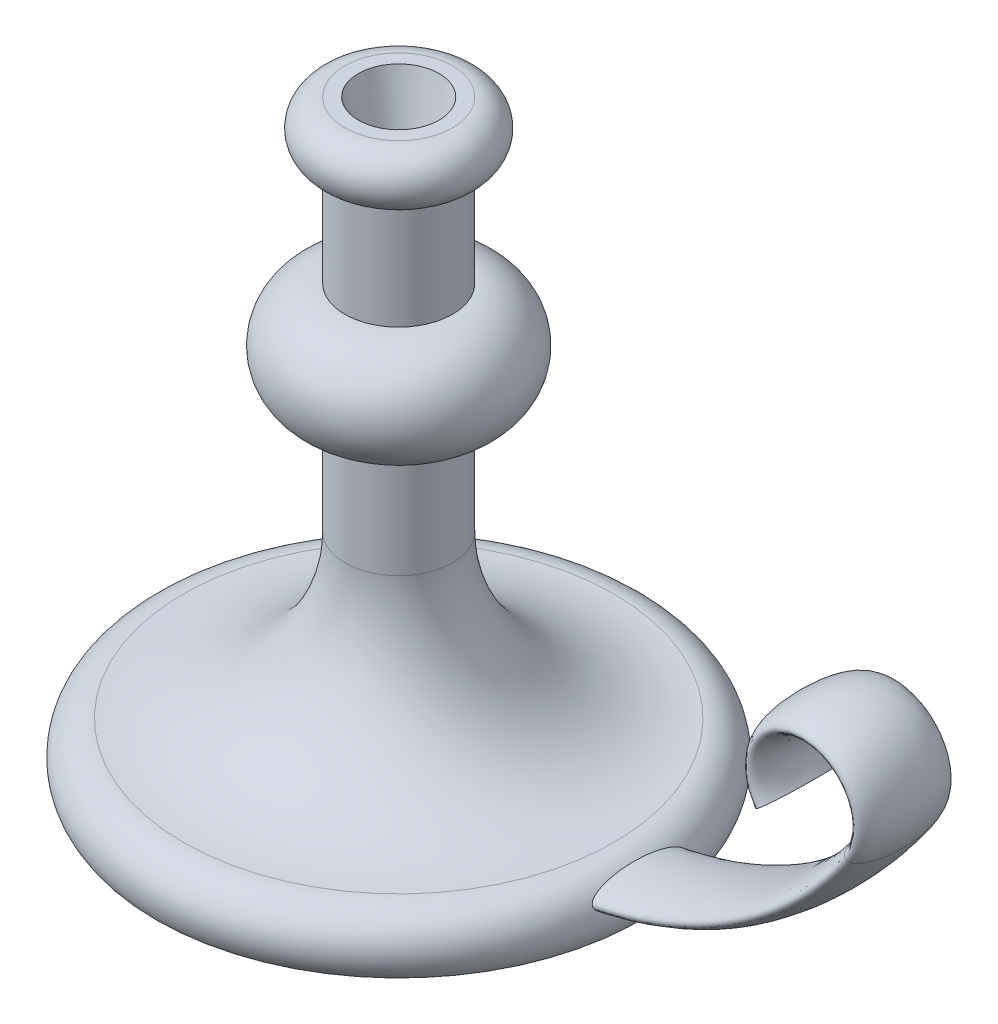
ISO-10303-21;
HEADER;
FILE_DESCRIPTION(('STEP AP214'),'2;1');
FILE_NAME('part.step','',(''),(''),'','','');
FILE_SCHEMA(('AUTOMOTIVE_DESIGN { 1 0 10303 214 1 1 1 1 }'));
ENDSEC;
DATA;
#1=APPLICATION_CONTEXT('core data for automotive mechanical design processes');
#2=APPLICATION_PROTOCOL_DEFINITION('international standard','automotive_design',2000,#1);
#3=PRODUCT_CONTEXT('',#1,'mechanical');
#4=PRODUCT('Part','Part','',(#3));
#5=PRODUCT_RELATED_PRODUCT_CATEGORY('part','',(#4));
#6=PRODUCT_DEFINITION_FORMATION('','',#4);
#7=PRODUCT_DEFINITION_CONTEXT('part definition',#1,'design');
#8=PRODUCT_DEFINITION('design','',#6,#7);
#9=PRODUCT_DEFINITION_SHAPE('','',#8);
#10=(LENGTH_UNIT() NAMED_UNIT(*) SI_UNIT(.MILLI.,.METRE.));
#11=(NAMED_UNIT(*) PLANE_ANGLE_UNIT() SI_UNIT($,.RADIAN.));
#12=(NAMED_UNIT(*) SI_UNIT($,.STERADIAN.) SOLID_ANGLE_UNIT());
#13=UNCERTAINTY_MEASURE_WITH_UNIT(LENGTH_MEASURE(1.E-05),#10,'distance_accuracy_value','');
#14=(GEOMETRIC_REPRESENTATION_CONTEXT(3) GLOBAL_UNCERTAINTY_ASSIGNED_CONTEXT((#13)) GLOBAL_UNIT_ASSIGNED_CONTEXT((#10,
#11,#12)) REPRESENTATION_CONTEXT('',''));
#15=CARTESIAN_POINT('',(0.,0.,0.));
#16=DIRECTION('',(0.,0.,1.));
#17=DIRECTION('',(1.,0.,0.));
#18=AXIS2_PLACEMENT_3D('',#15,#16,#17);
#19=CARTESIAN_POINT('',(0.,0.,0.));
#20=DIRECTION('',(0.,-1.,0.));
#21=DIRECTION('',(0.,0.,-1.));
#22=AXIS2_PLACEMENT_3D('',#19,#20,#21);
#23=PLANE('',#22);
#24=CARTESIAN_POINT('',(0.,0.,0.));
#25=DIRECTION('',(0.,-1.,0.));
#26=DIRECTION('',(0.,0.,-1.));
#27=AXIS2_PLACEMENT_3D('',#24,#25,#26);
#28=CIRCLE('',#27,90.);
#29=CARTESIAN_POINT('',(0.,0.,-90.));
#30=VERTEX_POINT('',#29);
#31=EDGE_CURVE('E81',#30,#30,#28,.T.);
#32=ORIENTED_EDGE('',*,*,#31,.T.);
#33=EDGE_LOOP('',(#32));
#34=FACE_BOUND('',#33,.T.);
#35=ADVANCED_FACE('F41',(#34),#23,.T.);
#36=CARTESIAN_POINT('',(0.,220.,0.));
#37=DIRECTION('',(0.,1.,0.));
#38=DIRECTION('',(0.,0.,1.));
#39=AXIS2_PLACEMENT_3D('',#36,#37,#38);
#40=PLANE('',#39);
#41=CARTESIAN_POINT('',(0.,220.,0.));
#42=DIRECTION('',(0.,1.,0.));
#43=DIRECTION('',(0.,0.,1.));
#44=AXIS2_PLACEMENT_3D('',#41,#42,#43);
#45=CIRCLE('',#44,15.);
#46=CARTESIAN_POINT('',(0.,220.,15.));
#47=VERTEX_POINT('',#46);
#48=EDGE_CURVE('E97',#47,#47,#45,.T.);
#49=ORIENTED_EDGE('',*,*,#48,.F.);
#50=EDGE_LOOP('',(#49));
#51=FACE_BOUND('',#50,.T.);
#52=CARTESIAN_POINT('',(0.,220.,0.));
#53=DIRECTION('',(0.,-1.,0.));
#54=DIRECTION('',(0.,0.,-1.));
#55=AXIS2_PLACEMENT_3D('',#52,#53,#54);
#56=CIRCLE('',#55,20.);
#57=CARTESIAN_POINT('',(0.,220.,-20.));
#58=VERTEX_POINT('',#57);
#59=EDGE_CURVE('E53',#58,#58,#56,.T.);
#60=ORIENTED_EDGE('',*,*,#59,.F.);
#61=EDGE_LOOP('',(#60));
#62=FACE_BOUND('',#61,.T.);
#63=ADVANCED_FACE('F104',(#51,#62),#40,.T.);
#64=CARTESIAN_POINT('',(0.,210.,0.));
#65=DIRECTION('',(0.,-1.,0.));
#66=DIRECTION('',(0.,0.,-1.));
#67=AXIS2_PLACEMENT_3D('',#64,#65,#66);
#68=TOROIDAL_SURFACE('',#67,20.,9.99999999999999);
#69=ORIENTED_EDGE('',*,*,#59,.T.);
#70=EDGE_LOOP('',(#69));
#71=FACE_BOUND('',#70,.T.);
#72=CARTESIAN_POINT('',(0.,200.,0.));
#73=DIRECTION('',(0.,-1.,0.));
#74=DIRECTION('',(0.,0.,-1.));
#75=AXIS2_PLACEMENT_3D('',#72,#73,#74);
#76=CIRCLE('',#75,20.);
#77=CARTESIAN_POINT('',(0.,200.,-20.));
#78=VERTEX_POINT('',#77);
#79=EDGE_CURVE('E58',#78,#78,#76,.T.);
#80=ORIENTED_EDGE('',*,*,#79,.F.);
#81=EDGE_LOOP('',(#80));
#82=FACE_BOUND('',#81,.T.);
#83=ADVANCED_FACE('F107',(#71,#82),#68,.T.);
#84=CARTESIAN_POINT('',(0.,0.,0.));
#85=DIRECTION('',(0.,-1.,0.));
#86=DIRECTION('',(0.,0.,-1.));
#87=AXIS2_PLACEMENT_3D('',#84,#85,#86);
#88=CYLINDRICAL_SURFACE('',#87,20.);
#89=ORIENTED_EDGE('',*,*,#79,.T.);
#90=EDGE_LOOP('',(#89));
#91=FACE_BOUND('',#90,.T.);
#92=CARTESIAN_POINT('',(0.,160.,0.));
#93=DIRECTION('',(0.,-1.,0.));
#94=DIRECTION('',(0.,0.,-1.));
#95=AXIS2_PLACEMENT_3D('',#92,#93,#94);
#96=CIRCLE('',#95,20.);
#97=CARTESIAN_POINT('',(0.,160.,-20.));
#98=VERTEX_POINT('',#97);
#99=EDGE_CURVE('E63',#98,#98,#96,.T.);
#100=ORIENTED_EDGE('',*,*,#99,.F.);
#101=EDGE_LOOP('',(#100));
#102=FACE_BOUND('',#101,.T.);
#103=ADVANCED_FACE('F113',(#91,#102),#88,.T.);
#104=CARTESIAN_POINT('',(0.,140.,0.));
#105=DIRECTION('',(0.,-1.,0.));
#106=DIRECTION('',(0.,0.,-1.));
#107=AXIS2_PLACEMENT_3D('',#104,#105,#106);
#108=TOROIDAL_SURFACE('',#107,20.,20.);
#109=ORIENTED_EDGE('',*,*,#99,.T.);
#110=EDGE_LOOP('',(#109));
#111=FACE_BOUND('',#110,.T.);
#112=CARTESIAN_POINT('',(0.,120.,0.));
#113=DIRECTION('',(0.,-1.,0.));
#114=DIRECTION('',(0.,0.,-1.));
#115=AXIS2_PLACEMENT_3D('',#112,#113,#114);
#116=CIRCLE('',#115,20.);
#117=CARTESIAN_POINT('',(0.,120.,-20.));
#118=VERTEX_POINT('',#117);
#119=EDGE_CURVE('E69',#118,#118,#116,.T.);
#120=ORIENTED_EDGE('',*,*,#119,.F.);
#121=EDGE_LOOP('',(#120));
#122=FACE_BOUND('',#121,.T.);
#123=ADVANCED_FACE('F120',(#111,#122),#108,.T.);
#124=CARTESIAN_POINT('',(0.,0.,0.));
#125=DIRECTION('',(0.,-1.,0.));
#126=DIRECTION('',(0.,0.,-1.));
#127=AXIS2_PLACEMENT_3D('',#124,#125,#126);
#128=CYLINDRICAL_SURFACE('',#127,20.);
#129=ORIENTED_EDGE('',*,*,#119,.T.);
#130=EDGE_LOOP('',(#129));
#131=FACE_BOUND('',#130,.T.);
#132=CARTESIAN_POINT('',(0.,80.,0.));
#133=DIRECTION('',(0.,-1.,0.));
#134=DIRECTION('',(0.,0.,-1.));
#135=AXIS2_PLACEMENT_3D('',#132,#133,#134);
#136=CIRCLE('',#135,20.);
#137=CARTESIAN_POINT('',(0.,80.,-20.));
#138=VERTEX_POINT('',#137);
#139=EDGE_CURVE('E73',#138,#138,#136,.T.);
#140=ORIENTED_EDGE('',*,*,#139,.F.);
#141=EDGE_LOOP('',(#140));
#142=FACE_BOUND('',#141,.T.);
#143=ADVANCED_FACE('F124',(#131,#142),#128,.T.);
#144=CARTESIAN_POINT('',(0.,80.,0.));
#145=DIRECTION('',(0.,-1.,0.));
#146=DIRECTION('',(0.,0.,-1.));
#147=AXIS2_PLACEMENT_3D('',#144,#145,#146);
#148=TOROIDAL_SURFACE('',#147,80.,60.);
#149=ORIENTED_EDGE('',*,*,#139,.T.);
#150=EDGE_LOOP('',(#149));
#151=FACE_BOUND('',#150,.T.);
#152=CARTESIAN_POINT('',(0.,20.,0.));
#153=DIRECTION('',(0.,-1.,0.));
#154=DIRECTION('',(0.,0.,-1.));
#155=AXIS2_PLACEMENT_3D('',#152,#153,#154);
#156=CIRCLE('',#155,80.);
#157=CARTESIAN_POINT('',(0.,20.,-80.));
#158=VERTEX_POINT('',#157);
#159=EDGE_CURVE('E77',#158,#158,#156,.T.);
#160=ORIENTED_EDGE('',*,*,#159,.F.);
#161=EDGE_LOOP('',(#160));
#162=FACE_BOUND('',#161,.T.);
#163=ADVANCED_FACE('F128',(#151,#162),#148,.F.);
#164=CARTESIAN_POINT('',(0.,7.50000000000003,0.));
#165=DIRECTION('',(0.,-1.,0.));
#166=DIRECTION('',(0.,0.,-1.));
#167=AXIS2_PLACEMENT_3D('',#164,#165,#166);
#168=TOROIDAL_SURFACE('',#167,80.,12.5);
#169=CARTESIAN_POINT('',(89.5597422043342,12.9414346567555,-17.5));
#170=CARTESIAN_POINT('',(89.5390618403562,12.9834100865229,-17.4999996776707));
#171=CARTESIAN_POINT('',(89.518481763466,13.0254349004937,-17.4978446678338));
#172=CARTESIAN_POINT('',(89.4776811982744,13.1092324497794,-17.4892861575811));
#173=CARTESIAN_POINT('',(89.4574608430711,13.1510050881611,-17.4828811168849));
#174=CARTESIAN_POINT('',(89.397540281121,13.2754779151414,-17.4575154450276));
#175=CARTESIAN_POINT('',(89.3585808220613,13.357332519418,-17.4324042670614));
#176=CARTESIAN_POINT('',(89.2734407804368,13.5379179993389,-17.3597430943198));
#177=CARTESIAN_POINT('',(89.2281116968574,13.6353152430682,-17.3079906529225));
#178=CARTESIAN_POINT('',(89.142156713761,13.8217570109409,-17.1881654215547));
#179=CARTESIAN_POINT('',(89.10154096816,13.9107834263932,-17.1200583326704));
#180=CARTESIAN_POINT('',(89.0298799325305,14.0690063055582,-16.9825317839868));
#181=CARTESIAN_POINT('',(88.9982856031081,14.1392491335226,-16.9145677994464));
#182=CARTESIAN_POINT('',(88.9378435588022,14.2742914925202,-16.7722502997375));
#183=CARTESIAN_POINT('',(88.9089980734782,14.3390866000317,-16.6978916893925));
#184=CARTESIAN_POINT('',(88.8536099995594,14.4639626152392,-16.5442177801531));
#185=CARTESIAN_POINT('',(88.8270733532937,14.5240313225779,-16.4648905452804));
#186=CARTESIAN_POINT('',(88.7760376587064,14.6398576639347,-16.3025863942461));
#187=CARTESIAN_POINT('',(88.7515379613228,14.6956166708123,-16.2196106536441));
#188=CARTESIAN_POINT('',(88.7047328205489,14.8023169553036,-16.052427362784));
#189=CARTESIAN_POINT('',(88.6823939519366,14.8533308765833,-15.9682752160745));
#190=CARTESIAN_POINT('',(88.6391553657591,14.9521540950118,-15.797741621076));
#191=CARTESIAN_POINT('',(88.6182558899722,14.9999628537458,-15.711359801597));
#192=CARTESIAN_POINT('',(88.5573681790009,15.1392585624723,-15.4492483073626));
#193=CARTESIAN_POINT('',(88.5192579811328,15.2264609786255,-15.2707999543232));
#194=CARTESIAN_POINT('',(88.4468979005837,15.3916731276291,-14.9088289385944));
#195=CARTESIAN_POINT('',(88.4126513155027,15.4696750103546,-14.7253021052891));
#196=CARTESIAN_POINT('',(88.347139159504,15.6182965032923,-14.3538259785736));
#197=CARTESIAN_POINT('',(88.3158872528146,15.6888824046965,-14.1658608782527));
#198=CARTESIAN_POINT('',(88.2560127035516,15.8233792512431,-13.787400391854));
#199=CARTESIAN_POINT('',(88.2273872233003,15.8872974109117,-13.5969079973403));
#200=CARTESIAN_POINT('',(88.1723348827449,16.0094159388249,-13.2138496737791));
#201=CARTESIAN_POINT('',(88.1459074726896,16.06761773743,-13.0212842768931));
#202=CARTESIAN_POINT('',(88.0884248304702,16.1932687928886,-12.5849658119248));
#203=CARTESIAN_POINT('',(88.0579162002184,16.2592725226906,-12.3407253521735));
#204=CARTESIAN_POINT('',(87.9994625659014,16.3844358500305,-11.8501803460782));
#205=CARTESIAN_POINT('',(87.9715178234089,16.4435947494061,-11.6038755919223));
#206=CARTESIAN_POINT('',(87.9178897421858,16.5558889779776,-11.109529987048));
#207=CARTESIAN_POINT('',(87.8922075114269,16.6090213595568,-10.8614883492401));
#208=CARTESIAN_POINT('',(87.8429155378604,16.7098546386226,-10.3640943607019));
#209=CARTESIAN_POINT('',(87.8193058942812,16.7575552760878,-10.1147419478212));
#210=CARTESIAN_POINT('',(87.7514718906047,16.8930622945828,-9.36631396644913));
#211=CARTESIAN_POINT('',(87.7101114199141,16.97354616682,-8.86564202060328));
#212=CARTESIAN_POINT('',(87.6344118706354,17.1178657179368,-7.86153551840245));
#213=CARTESIAN_POINT('',(87.600071334108,17.1817048544489,-7.35810155802581));
#214=CARTESIAN_POINT('',(87.5383679228555,17.2943697092708,-6.35225136111892));
#215=CARTESIAN_POINT('',(87.5109639050819,17.3432843238913,-5.84984753787574));
#216=CARTESIAN_POINT('',(87.4628391630612,17.4279603163538,-4.84354228831028));
#217=CARTESIAN_POINT('',(87.4421195253373,17.4637195559667,-4.33964063194108));
#218=CARTESIAN_POINT('',(87.4074386787955,17.5229738360404,-3.33084363886031));
#219=CARTESIAN_POINT('',(87.3934780874882,17.5464677559495,-2.82594821558699));
#220=CARTESIAN_POINT('',(87.3724154174236,17.5817273168609,-1.8161521338082));
#221=CARTESIAN_POINT('',(87.3653059747339,17.5935055508652,-1.31125206554537));
#222=CARTESIAN_POINT('',(87.3579750479625,17.6056484066489,-0.301318309133074));
#223=CARTESIAN_POINT('',(87.3577528582351,17.6060141977103,0.203715360025927));
#224=CARTESIAN_POINT('',(87.3641963426439,17.5953454261039,1.21356726554153));
#225=CARTESIAN_POINT('',(87.3708612610897,17.5843121142069,1.71838551945493));
#226=CARTESIAN_POINT('',(87.3886163883339,17.5546163065411,2.60695068649837));
#227=CARTESIAN_POINT('',(87.3982690399213,17.5384060734754,2.99081046478823));
#228=CARTESIAN_POINT('',(87.421496688066,17.4990063104014,3.75807002785696));
#229=CARTESIAN_POINT('',(87.4350718235981,17.4758165331044,4.14146979585412));
#230=CARTESIAN_POINT('',(87.4661109016122,17.4221255760208,4.90767543763193));
#231=CARTESIAN_POINT('',(87.4835755913649,17.3916229911934,5.29048118303743));
#232=CARTESIAN_POINT('',(87.52247652696,17.3226675403927,6.0572876660802));
#233=CARTESIAN_POINT('',(87.5439339089184,17.2841722314847,6.44128353835425));
#234=CARTESIAN_POINT('',(87.5907685418077,17.1987228636429,7.2080308106754));
#235=CARTESIAN_POINT('',(87.6161451191906,17.1517702579396,7.59078241304214));
#236=CARTESIAN_POINT('',(87.6708875244929,17.0486132676473,8.35453102594098));
#237=CARTESIAN_POINT('',(87.7002509792864,16.9924143825779,8.73552894189119));
#238=CARTESIAN_POINT('',(87.7555693385742,16.8844873931685,9.40362807317329));
#239=CARTESIAN_POINT('',(87.7806318626291,16.8349635590469,9.69115955865546));
#240=CARTESIAN_POINT('',(87.8333287645208,16.7293167465829,10.2648242071221));
#241=CARTESIAN_POINT('',(87.8609635304672,16.6731927720485,10.5509571522121));
#242=CARTESIAN_POINT('',(87.9190678138249,16.5534902310352,11.1217112831611));
#243=CARTESIAN_POINT('',(87.9495404231884,16.4899035134826,11.4063304543323));
#244=CARTESIAN_POINT('',(88.0137266324376,16.3541216812727,11.9738772339475));
#245=CARTESIAN_POINT('',(88.0474477220507,16.2819065762202,12.2567992545897));
#246=CARTESIAN_POINT('',(88.1183718381953,16.1280994435204,12.8175821097587));
#247=CARTESIAN_POINT('',(88.1555499028383,16.0465737963571,13.0954641920681));
#248=CARTESIAN_POINT('',(88.2343580118385,15.8719007074314,13.6468218234685));
#249=CARTESIAN_POINT('',(88.2759857295858,15.7787593350285,13.9202995902181));
#250=CARTESIAN_POINT('',(88.3426568223939,15.628384040649,14.325405281709));
#251=CARTESIAN_POINT('',(88.3655500017785,15.5765627213433,14.4594023169279));
#252=CARTESIAN_POINT('',(88.4129882653633,15.4688611687535,14.7254525655374));
#253=CARTESIAN_POINT('',(88.4375331689951,15.4129813790936,14.8575059894885));
#254=CARTESIAN_POINT('',(88.4884967907572,15.2967269720351,15.1188747284342));
#255=CARTESIAN_POINT('',(88.5149109123159,15.2363633637366,15.2481958098578));
#256=CARTESIAN_POINT('',(88.5700241751771,15.1103179001212,15.503703564208));
#257=CARTESIAN_POINT('',(88.5987227483178,15.044637367099,15.6298910063172));
#258=CARTESIAN_POINT('',(88.6570151826478,14.911317960161,15.8704199707058));
#259=CARTESIAN_POINT('',(88.686441736786,14.844056340729,15.9850095995259));
#260=CARTESIAN_POINT('',(88.7482816567768,14.7030103830827,16.2094581395951));
#261=CARTESIAN_POINT('',(88.7806974756141,14.6292206899982,16.3193130551167));
#262=CARTESIAN_POINT('',(88.8489097184972,14.4745639616532,16.5315146626622));
#263=CARTESIAN_POINT('',(88.8846785573508,14.3937550191612,16.6339121024915));
#264=CARTESIAN_POINT('',(88.9606113704153,14.2232561160767,16.8291907541921));
#265=CARTESIAN_POINT('',(89.0007675950254,14.1335818404866,16.9220882016582));
#266=CARTESIAN_POINT('',(89.0601235459873,14.0021924630806,17.0411637727684));
#267=CARTESIAN_POINT('',(89.0770574086405,13.9648250339928,17.0732949178269));
#268=CARTESIAN_POINT('',(89.1117704043089,13.8885105828124,17.1351129203988));
#269=CARTESIAN_POINT('',(89.1295494801998,13.8495636674963,17.1647999427301));
#270=CARTESIAN_POINT('',(89.1842722230347,13.7301865324199,17.249667258303));
#271=CARTESIAN_POINT('',(89.2225929343975,13.6472387371287,17.3006362954166));
#272=CARTESIAN_POINT('',(89.2830198855204,13.5177923286577,17.3659392171784));
#273=CARTESIAN_POINT('',(89.3038035106325,13.4734899832392,17.3859446551269));
#274=CARTESIAN_POINT('',(89.346235727213,13.3835498526413,17.421521231844));
#275=CARTESIAN_POINT('',(89.3678838017236,13.3379128698459,17.4370949768747));
#276=CARTESIAN_POINT('',(89.411904802424,13.2456714845449,17.4633118273198));
#277=CARTESIAN_POINT('',(89.4342765183816,13.1990687398025,17.4739627514632));
#278=CARTESIAN_POINT('',(89.4796070415906,13.1052444737538,17.4900003628641));
#279=CARTESIAN_POINT('',(89.5025657624808,13.0580230439623,17.4953878199709));
#280=CARTESIAN_POINT('',(89.5464271716018,12.9684112208446,17.5004320668286));
#281=CARTESIAN_POINT('',(89.5672934245651,12.9260327119427,17.5006298436875));
#282=CARTESIAN_POINT('',(89.6091580078856,12.8415284156484,17.496667300483));
#283=CARTESIAN_POINT('',(89.6301563797468,12.7994027167222,17.4925055351934));
#284=CARTESIAN_POINT('',(89.672115635143,12.7157496198109,17.479965082583));
#285=CARTESIAN_POINT('',(89.6930765014329,12.6742224548789,17.4715847960013));
#286=CARTESIAN_POINT('',(89.7348115258834,12.5920532516239,17.4508625220261));
#287=CARTESIAN_POINT('',(89.7555855765781,12.5514117057389,17.4385183877269));
#288=CARTESIAN_POINT('',(89.8013847331777,12.4623676182578,17.407062698976));
#289=CARTESIAN_POINT('',(89.8263321178974,12.4142402057079,17.3870577635768));
#290=CARTESIAN_POINT('',(89.8756026524762,12.319894282953,17.3423007335128));
#291=CARTESIAN_POINT('',(89.8999253272691,12.2736772101064,17.317545140678));
#292=CARTESIAN_POINT('',(89.9718636752115,12.1379719567039,17.2371059859825));
#293=CARTESIAN_POINT('',(90.018402650877,12.0515209207991,17.1752845379974));
#294=CARTESIAN_POINT('',(90.1015176697339,11.8991704299988,17.0502729237445));
#295=CARTESIAN_POINT('',(90.1385373685485,11.8321383297491,16.9886971231214));
#296=CARTESIAN_POINT('',(90.2104869329279,11.7032426034952,16.8591573255863));
#297=CARTESIAN_POINT('',(90.2454151408799,11.641383062009,16.7911883686368));
#298=CARTESIAN_POINT('',(90.3133841124365,11.5222099067343,16.6502911436159));
#299=CARTESIAN_POINT('',(90.3464212107124,11.4649050425001,16.5773538074551));
#300=CARTESIAN_POINT('',(90.4107258034174,11.3544143267813,16.4277349965841));
#301=CARTESIAN_POINT('',(90.4419937497579,11.3012274221163,16.3510544874359));
#302=CARTESIAN_POINT('',(90.5066142435687,11.1922810586097,16.1853189525371));
#303=CARTESIAN_POINT('',(90.5397652495638,11.1369814833087,16.0958847835333));
#304=CARTESIAN_POINT('',(90.6043042941241,11.0303194621558,15.9140859303208));
#305=CARTESIAN_POINT('',(90.6356921559875,10.9789574107341,15.8217209538338));
#306=CARTESIAN_POINT('',(90.696838387797,10.8797698841652,15.6347974994416));
#307=CARTESIAN_POINT('',(90.7265992701636,10.8319389137699,15.5402427441422));
#308=CARTESIAN_POINT('',(90.7846969346251,10.7393295137682,15.3492353522608));
#309=CARTESIAN_POINT('',(90.8130337948203,10.6945509167068,15.2527828201666));
#310=CARTESIAN_POINT('',(90.8771212205238,10.594058959755,15.0277319837686));
#311=CARTESIAN_POINT('',(90.9124022819657,10.5393328792867,14.8985593440144));
#312=CARTESIAN_POINT('',(90.98097411038,10.4339610325185,14.6380328432612));
#313=CARTESIAN_POINT('',(91.0142645951401,10.3833158444319,14.5066786763351));
#314=CARTESIAN_POINT('',(91.1115171918212,10.2366440116078,14.1096810918785));
#315=CARTESIAN_POINT('',(91.1727828792965,10.1460018602116,13.8413800425923));
#316=CARTESIAN_POINT('',(91.2892862812459,9.97615455726929,13.2997906638464));
#317=CARTESIAN_POINT('',(91.3445203789086,9.89695625887054,13.0264994554541));
#318=CARTESIAN_POINT('',(91.4499805719979,9.74769654866283,12.4748594155954));
#319=CARTESIAN_POINT('',(91.5001780442571,9.67768673078036,12.1964912536704));
#320=CARTESIAN_POINT('',(91.5957501918066,9.54592534416406,11.6372393425751));
#321=CARTESIAN_POINT('',(91.6411285723792,9.48416742117649,11.3563577087913));
#322=CARTESIAN_POINT('',(91.7275132616963,9.36779787162567,10.7925089006684));
#323=CARTESIAN_POINT('',(91.7685202729418,9.31318509647942,10.5095420692691));
#324=CARTESIAN_POINT('',(91.8503345045435,9.20520508711823,9.91387150213689));
#325=CARTESIAN_POINT('',(91.8907217744487,9.1524939009583,9.60099168323671));
#326=CARTESIAN_POINT('',(91.9669218199108,9.0538915870555,8.97359688182011));
#327=CARTESIAN_POINT('',(92.0027343661629,9.00800080116155,8.65908181815988));
#328=CARTESIAN_POINT('',(92.0700329889399,8.92240020575322,8.02865568808826));
#329=CARTESIAN_POINT('',(92.1015177516248,8.88269227276211,7.71274422766544));
#330=CARTESIAN_POINT('',(92.1603325838502,8.80898713679321,7.07986626810666));
#331=CARTESIAN_POINT('',(92.1876625005418,8.77499014390515,6.76289973059457));
#332=CARTESIAN_POINT('',(92.263503001365,8.68114273902112,5.812498683623));
#333=CARTESIAN_POINT('',(92.3060517448553,8.62919999492203,5.17778747193929));
#334=CARTESIAN_POINT('',(92.3760091017523,8.54431318450699,3.90627938186918));
#335=CARTESIAN_POINT('',(92.4034169750228,8.51137004695195,3.26948240305385));
#336=CARTESIAN_POINT('',(92.4435085691827,8.46331702284124,1.9954574177855));
#337=CARTESIAN_POINT('',(92.4562084043365,8.4481876190885,1.3582306498553));
#338=CARTESIAN_POINT('',(92.4671302630246,8.43517103988553,0.0834423270827412));
#339=CARTESIAN_POINT('',(92.4653514271759,8.43728488791032,-0.554119245386077));
#340=CARTESIAN_POINT('',(92.4472853754493,8.45883344750917,-1.82886328296779));
#341=CARTESIAN_POINT('',(92.4309954438925,8.47827140120321,-2.46604565477886));
#342=CARTESIAN_POINT('',(92.3836590626411,8.53514174464782,-3.73902583866786));
#343=CARTESIAN_POINT('',(92.3526140808134,8.57257234445206,-4.37482378215281));
#344=CARTESIAN_POINT('',(92.2921790866405,8.64621329194978,-5.36625544460756));
#345=CARTESIAN_POINT('',(92.268011823561,8.67578736963461,-5.72271555901649));
#346=CARTESIAN_POINT('',(92.2147013952357,8.74146404735369,-6.4346581960309));
#347=CARTESIAN_POINT('',(92.1855583836335,8.77756644580516,-6.79014074847775));
#348=CARTESIAN_POINT('',(92.1221127048895,8.85679311513327,-7.49983836059286));
#349=CARTESIAN_POINT('',(92.0878103957551,8.89991689880798,-7.85405350646273));
#350=CARTESIAN_POINT('',(92.0137981226252,8.99384143269624,-8.56089767223737));
#351=CARTESIAN_POINT('',(91.974088334396,9.04464193338955,-8.91352674331166));
#352=CARTESIAN_POINT('',(91.9015818240065,9.1384256229369,-9.51226790232948));
#353=CARTESIAN_POINT('',(91.8702370654073,9.17924629619408,-9.75889575934039));
#354=CARTESIAN_POINT('',(91.8045624920059,9.26550036635884,-10.2509419620287));
#355=CARTESIAN_POINT('',(91.7702327567072,9.31093364041741,-10.4963603397361));
#356=CARTESIAN_POINT('',(91.6984266463274,9.40685898724853,-10.9855805665722));
#357=CARTESIAN_POINT('',(91.6609523533818,9.45734771681937,-11.2293833718154));
#358=CARTESIAN_POINT('',(91.5826038967894,9.56401317098998,-11.7151775621035));
#359=CARTESIAN_POINT('',(91.5417298772539,9.62018965451286,-11.9571690234563));
#360=CARTESIAN_POINT('',(91.4386423376749,9.76351210996355,-12.5384162018473));
#361=CARTESIAN_POINT('',(91.374585890329,9.85386844470717,-12.8765786557761));
#362=CARTESIAN_POINT('',(91.2720163238269,10.0014015523804,-13.3793136041302));
#363=CARTESIAN_POINT('',(91.2367090969994,10.0526332971691,-13.5462966134998));
#364=CARTESIAN_POINT('',(91.1637294936459,10.1596261841616,-13.8782853379546));
#365=CARTESIAN_POINT('',(91.1260572231723,10.2153871233016,-14.0432911413066));
#366=CARTESIAN_POINT('',(91.0448513753999,10.3369382727866,-14.3844416693121));
#367=CARTESIAN_POINT('',(91.0010908407917,10.4031767890595,-14.5603739146107));
#368=CARTESIAN_POINT('',(90.9100440331648,10.5428509324195,-14.9085311659824));
#369=CARTESIAN_POINT('',(90.8627565865347,10.6162889577861,-15.0807549132307));
#370=CARTESIAN_POINT('',(90.7642492199856,10.7715651970479,-15.4195496037297));
#371=CARTESIAN_POINT('',(90.7130423069868,10.8533759065566,-15.5861368065579));
#372=CARTESIAN_POINT('',(90.6058220172115,11.0275348916427,-15.9120386126944));
#373=CARTESIAN_POINT('',(90.5498128203454,11.1198740259078,-16.0713593593319));
#374=CARTESIAN_POINT('',(90.4444082893052,11.2969255920339,-16.3465910082036));
#375=CARTESIAN_POINT('',(90.3961277047706,11.3791055101423,-16.4645448336185));
#376=CARTESIAN_POINT('',(90.2950977924849,11.5538633486864,-16.6911566146548));
#377=CARTESIAN_POINT('',(90.2423390562533,11.6464633011951,-16.7997939840164));
#378=CARTESIAN_POINT('',(90.1590440243458,11.7953014200271,-16.9524870890684));
#379=CARTESIAN_POINT('',(90.1303607600849,11.8469859215395,-17.0019977189779));
#380=CARTESIAN_POINT('',(90.0716181087376,11.9538274561508,-17.0963102611097));
#381=CARTESIAN_POINT('',(90.0415584049396,12.0089852895522,-17.1411110817337));
#382=CARTESIAN_POINT('',(89.9801756575597,12.1227246632088,-17.2246441347396));
#383=CARTESIAN_POINT('',(89.9488577537652,12.1812926416247,-17.2633984155371));
#384=CARTESIAN_POINT('',(89.884954967133,12.302014400506,-17.333578440643));
#385=CARTESIAN_POINT('',(89.8523712452275,12.3641649194653,-17.3650107233703));
#386=CARTESIAN_POINT('',(89.7981176909035,12.4687258013534,-17.4092508881814));
#387=CARTESIAN_POINT('',(89.7767436177657,12.5101841078544,-17.4246893204627));
#388=CARTESIAN_POINT('',(89.7336969050676,12.5942336377176,-17.4515182330192));
#389=CARTESIAN_POINT('',(89.7120243813913,12.6368244270178,-17.4629102408532));
#390=CARTESIAN_POINT('',(89.6685521390584,12.7228207531291,-17.4812886417918));
#391=CARTESIAN_POINT('',(89.6467526103347,12.7662252198269,-17.488280453409));
#392=CARTESIAN_POINT('',(89.6031794397247,12.8535466229688,-17.4976362320133));
#393=CARTESIAN_POINT('',(89.5814057970823,12.8974635440191,-17.5000003376542));
#394=CARTESIAN_POINT('',(89.5597422043342,12.9414346567555,-17.5));
#395=B_SPLINE_CURVE_WITH_KNOTS('',3,(#169,#170,#171,#172,#173,#174,#175,#176,#177,#178,#179,
#180,#181,#182,#183,#184,#185,#186,#187,#188,#189,#190,#191,#192,#193,#194,#195,#196,#197,#198,
#199,#200,#201,#202,#203,#204,#205,#206,#207,#208,#209,#210,#211,#212,#213,#214,#215,#216,#217,
#218,#219,#220,#221,#222,#223,#224,#225,#226,#227,#228,#229,#230,#231,#232,#233,#234,#235,#236,
#237,#238,#239,#240,#241,#242,#243,#244,#245,#246,#247,#248,#249,#250,#251,#252,#253,#254,#255,
#256,#257,#258,#259,#260,#261,#262,#263,#264,#265,#266,#267,#268,#269,#270,#271,#272,#273,#274,
#275,#276,#277,#278,#279,#280,#281,#282,#283,#284,#285,#286,#287,#288,#289,#290,#291,#292,#293,
#294,#295,#296,#297,#298,#299,#300,#301,#302,#303,#304,#305,#306,#307,#308,#309,#310,#311,#312,
#313,#314,#315,#316,#317,#318,#319,#320,#321,#322,#323,#324,#325,#326,#327,#328,#329,#330,#331,
#332,#333,#334,#335,#336,#337,#338,#339,#340,#341,#342,#343,#344,#345,#346,#347,#348,#349,#350,
#351,#352,#353,#354,#355,#356,#357,#358,#359,#360,#361,#362,#363,#364,#365,#366,#367,#368,#369,
#370,#371,#372,#373,#374,#375,#376,#377,#378,#379,#380,#381,#382,#383,#384,#385,#386,#387,#388,
#389,#390,#391,#392,#393,#394),.UNSPECIFIED.,.T.,.F.,(4,2,2,2,2,2,2,2,2,2,2,2,2,2,2,2,2,2,2,2,2,
2,2,2,2,2,2,2,2,2,2,2,2,2,2,2,2,2,2,2,2,2,2,2,2,2,2,2,2,2,2,2,2,2,2,2,2,2,2,2,2,2,2,2,2,2,2,2,2,
2,2,2,2,2,2,2,2,2,2,2,2,2,2,2,2,2,2,2,2,2,2,2,2,2,2,2,2,2,2,2,2,2,2,2,2,2,2,2,2,2,2,2,4),(0.,
0.140326879649323,0.280704643844325,0.561461806499964,0.917225717585821,1.27374235386085,
1.58146302398146,1.88943119593641,2.19816989275474,2.50680983170024,2.80944292372748,
3.11212672643254,3.71838915770189,4.32516518168242,4.93458970782537,5.54334784093529,
6.15195325906639,6.91631911029035,7.68076285707076,8.44557890144713,9.21043154271116,
10.7363530227226,12.2619572680849,13.7782885580521,15.2948661984781,16.81158236824,
18.3266664767783,19.8415953542034,21.3563580231467,22.5092504482306,23.6621837256807,
24.8153386988896,25.9747813799629,27.1340250219352,28.2925816429423,29.1710242088837,
30.0495995331112,30.929143559154,31.8107663507032,32.6864555684205,33.5616891298973,
33.9980703124475,34.4344038665401,34.8696994156044,35.3048870393028,35.7129485465611,
36.1213479397351,36.5266413619583,36.9312301321628,37.0874810726009,37.2437214677036,
37.5562829439448,37.714714834319,37.8730533580125,38.0311395270882,38.1892025705741,
38.3307149014327,38.4722741597122,38.6138871242241,38.755576919115,38.9286541005772,
39.101859220718,39.4485901352339,39.7429975955385,40.037635381819,40.3328261359406,
40.627941143042,40.9585479808933,41.2891878931727,41.6193018978013,41.9493977775687,
42.3832551508596,42.8171738887965,43.6859467918762,44.5552378220695,45.4292182663355,
46.3025217875271,47.1756847521802,48.1351081860322,49.0945796914512,50.054341835485,
51.0141392787922,52.9283366635998,54.842627612507,56.7548192562797,58.6671243992147,
60.5797874956846,62.4922603557677,63.567681932183,64.6430703071857,65.7183840946011,
66.7936629380609,67.5494303160589,68.3051775707178,69.0604283053765,69.8156470419342,
70.8826765887343,71.417205756179,71.9517109715321,72.530589486172,73.1096614946427,
73.6868888443987,74.2636187787007,74.7180950553371,75.1735510009085,75.4046853668798,
75.6358731855892,75.8661972266862,76.0963147970915,76.2435550398532,76.3907396389801,
76.5377426347988,76.6847412260986),.UNSPECIFIED.);
#396=CARTESIAN_POINT('',(89.5597422043342,12.9414346567555,-17.5));
#397=VERTEX_POINT('',#396);
#398=EDGE_CURVE('E10',#397,#397,#395,.T.);
#399=ORIENTED_EDGE('',*,*,#398,.F.);
#400=EDGE_LOOP('',(#399));
#401=FACE_BOUND('',#400,.T.);
#402=ORIENTED_EDGE('',*,*,#159,.T.);
#403=EDGE_LOOP('',(#402));
#404=FACE_BOUND('',#403,.T.);
#405=ORIENTED_EDGE('',*,*,#31,.F.);
#406=EDGE_LOOP('',(#405));
#407=FACE_BOUND('',#406,.T.);
#408=ADVANCED_FACE('F131',(#401,#404,#407),#168,.T.);
#409=CARTESIAN_POINT('',(150.634185358261,75.,0.));
#410=DIRECTION('',(0.566666666666666,-0.823947139620552,0.));
#411=DIRECTION('',(0.,0.,-1.));
#412=AXIS2_PLACEMENT_3D('',#409,#410,#411);
#413=PLANE('',#412);
#414=CARTESIAN_POINT('',(150.634185358261,75.,0.));
#415=DIRECTION('',(0.566666666666666,-0.823947139620552,0.));
#416=DIRECTION('',(0.,0.,-1.));
#417=AXIS2_PLACEMENT_3D('',#414,#415,#416);
#418=ELLIPSE('',#417,17.5,5.);
#419=CARTESIAN_POINT('',(150.634185358261,75.,-17.5));
#420=VERTEX_POINT('',#419);
#421=EDGE_CURVE('E85',#420,#420,#418,.T.);
#422=ORIENTED_EDGE('',*,*,#421,.T.);
#423=EDGE_LOOP('',(#422));
#424=FACE_BOUND('',#423,.T.);
#425=ADVANCED_FACE('F136',(#424),#413,.T.);
#426=CARTESIAN_POINT('',(60.,10.,-17.5));
#427=CARTESIAN_POINT('',(110.410191303973,10.,-17.5));
#428=CARTESIAN_POINT('',(155.026295870831,33.4646670673665,-17.5));
#429=CARTESIAN_POINT('',(183.592070943083,75.,-17.5));
#430=CARTESIAN_POINT('',(60.,20.,-17.5));
#431=CARTESIAN_POINT('',(107.049511883708,20.,-17.5));
#432=CARTESIAN_POINT('',(148.691209479443,41.900355929542,-17.5));
#433=CARTESIAN_POINT('',(175.352599546877,80.6666666666666,-17.5));
#434=CARTESIAN_POINT('',(60.,20.,17.5));
#435=CARTESIAN_POINT('',(107.049511883708,20.,17.5));
#436=CARTESIAN_POINT('',(148.691209479443,41.900355929542,17.5));
#437=CARTESIAN_POINT('',(175.352599546877,80.6666666666666,17.5));
#438=CARTESIAN_POINT('',(60.,10.,17.5));
#439=CARTESIAN_POINT('',(110.410191303973,10.,17.5));
#440=CARTESIAN_POINT('',(155.026295870831,33.4646670673665,17.5));
#441=CARTESIAN_POINT('',(183.592070943083,75.,17.5));
#442=CARTESIAN_POINT('',(60.,0.,17.5));
#443=CARTESIAN_POINT('',(113.770870724238,0.,17.5));
#444=CARTESIAN_POINT('',(161.36138226222,25.0289782051909,17.5));
#445=CARTESIAN_POINT('',(191.831542339288,69.3333333333333,17.5));
#446=CARTESIAN_POINT('',(60.,0.,-17.5));
#447=CARTESIAN_POINT('',(113.770870724238,0.,-17.5));
#448=CARTESIAN_POINT('',(161.36138226222,25.0289782051909,-17.5));
#449=CARTESIAN_POINT('',(191.831542339288,69.3333333333333,-17.5));
#450=CARTESIAN_POINT('',(60.,10.,-17.5));
#451=CARTESIAN_POINT('',(110.410191303973,10.,-17.5));
#452=CARTESIAN_POINT('',(155.026295870831,33.4646670673665,-17.5));
#453=CARTESIAN_POINT('',(183.592070943083,75.,-17.5));
#454=(BOUNDED_SURFACE() B_SPLINE_SURFACE(3,3,((#426,#427,#428,#429),(#430,#431,#432,#433),(#434,
#435,#436,#437),(#438,#439,#440,#441),(#442,#443,#444,#445),(#446,#447,#448,#449),(#450,#451,
#452,#453)),.UNSPECIFIED.,.T.,.F.,.F.) B_SPLINE_SURFACE_WITH_KNOTS((4,3,4),(4,4),(0.,0.5,1.),
(0.,1.),.UNSPECIFIED.) GEOMETRIC_REPRESENTATION_ITEM() RATIONAL_B_SPLINE_SURFACE(((1.,
0.923374135437856,0.923374135437856,1.),(0.333333333333333,0.307791378479285,0.307791378479285,
0.333333333333333),(0.333333333333333,0.307791378479285,0.307791378479285,0.333333333333333),
(1.,0.923374135437856,0.923374135437856,1.),(0.333333333333333,0.307791378479285,
0.307791378479285,0.333333333333333),(0.333333333333333,0.307791378479285,0.307791378479285,
0.333333333333333),(1.,0.923374135437856,0.923374135437856,1.))) REPRESENTATION_ITEM('') SURFACE());
#455=CARTESIAN_POINT('',(183.592070943083,75.,0.));
#456=DIRECTION('',(0.566666666666667,0.823947139620552,0.));
#457=DIRECTION('',(0.,0.,-1.));
#458=AXIS2_PLACEMENT_3D('',#455,#456,#457);
#459=ELLIPSE('',#458,17.5,5.);
#460=CARTESIAN_POINT('',(183.592070943083,75.,-17.5));
#461=VERTEX_POINT('',#460);
#462=EDGE_CURVE('E89',#461,#461,#459,.T.);
#463=ORIENTED_EDGE('',*,*,#398,.T.);
#464=EDGE_LOOP('',(#463));
#465=FACE_BOUND('',#464,.T.);
#466=ORIENTED_EDGE('',*,*,#462,.F.);
#467=EDGE_LOOP('',(#466));
#468=FACE_BOUND('',#467,.T.);
#469=ADVANCED_FACE('F141',(#465,#468),#454,.T.);
#470=CARTESIAN_POINT('',(183.592070943083,75.,-17.5));
#471=CARTESIAN_POINT('',(193.981461744242,90.10642735238,-17.5));
#472=CARTESIAN_POINT('',(185.447347211541,106.333333333333,-17.5));
#473=CARTESIAN_POINT('',(167.113128150672,106.333333333333,-17.5));
#474=CARTESIAN_POINT('',(148.778909089802,106.333333333333,-17.5));
#475=CARTESIAN_POINT('',(140.244794557101,90.1064273523801,-17.5));
#476=CARTESIAN_POINT('',(150.634185358261,75.,-17.5));
#477=CARTESIAN_POINT('',(175.352599546877,80.6666666666667,-17.5));
#478=CARTESIAN_POINT('',(180.547294947457,88.2198803428567,-17.5));
#479=CARTESIAN_POINT('',(176.280237681107,96.3333333333333,-17.5));
#480=CARTESIAN_POINT('',(167.113128150672,96.3333333333333,-17.5));
#481=CARTESIAN_POINT('',(157.946018620237,96.3333333333334,-17.5));
#482=CARTESIAN_POINT('',(153.678961353886,88.2198803428568,-17.5));
#483=CARTESIAN_POINT('',(158.873656754466,80.6666666666667,-17.5));
#484=CARTESIAN_POINT('',(175.352599546877,80.6666666666667,17.5));
#485=CARTESIAN_POINT('',(180.547294947457,88.2198803428567,17.5));
#486=CARTESIAN_POINT('',(176.280237681107,96.3333333333333,17.5));
#487=CARTESIAN_POINT('',(167.113128150672,96.3333333333333,17.5));
#488=CARTESIAN_POINT('',(157.946018620237,96.3333333333334,17.5));
#489=CARTESIAN_POINT('',(153.678961353886,88.2198803428568,17.5));
#490=CARTESIAN_POINT('',(158.873656754466,80.6666666666667,17.5));
#491=CARTESIAN_POINT('',(183.592070943083,75.,17.5));
#492=CARTESIAN_POINT('',(193.981461744242,90.10642735238,17.5));
#493=CARTESIAN_POINT('',(185.447347211541,106.333333333333,17.5));
#494=CARTESIAN_POINT('',(167.113128150672,106.333333333333,17.5));
#495=CARTESIAN_POINT('',(148.778909089802,106.333333333333,17.5));
#496=CARTESIAN_POINT('',(140.244794557101,90.1064273523801,17.5));
#497=CARTESIAN_POINT('',(150.634185358261,75.,17.5));
#498=CARTESIAN_POINT('',(191.831542339288,69.3333333333333,17.5));
#499=CARTESIAN_POINT('',(207.415628541027,91.9929743619034,17.5));
#500=CARTESIAN_POINT('',(194.614456741976,116.333333333333,17.5));
#501=CARTESIAN_POINT('',(167.113128150672,116.333333333333,17.5));
#502=CARTESIAN_POINT('',(139.611799559367,116.333333333333,17.5));
#503=CARTESIAN_POINT('',(126.810627760316,91.9929743619035,17.5));
#504=CARTESIAN_POINT('',(142.394713962055,69.3333333333333,17.5));
#505=CARTESIAN_POINT('',(191.831542339288,69.3333333333333,-17.5));
#506=CARTESIAN_POINT('',(207.415628541027,91.9929743619034,-17.5));
#507=CARTESIAN_POINT('',(194.614456741976,116.333333333333,-17.5));
#508=CARTESIAN_POINT('',(167.113128150672,116.333333333333,-17.5));
#509=CARTESIAN_POINT('',(139.611799559367,116.333333333333,-17.5));
#510=CARTESIAN_POINT('',(126.810627760316,91.9929743619035,-17.5));
#511=CARTESIAN_POINT('',(142.394713962055,69.3333333333333,-17.5));
#512=CARTESIAN_POINT('',(183.592070943083,75.,-17.5));
#513=CARTESIAN_POINT('',(193.981461744242,90.10642735238,-17.5));
#514=CARTESIAN_POINT('',(185.447347211541,106.333333333333,-17.5));
#515=CARTESIAN_POINT('',(167.113128150672,106.333333333333,-17.5));
#516=CARTESIAN_POINT('',(148.778909089802,106.333333333333,-17.5));
#517=CARTESIAN_POINT('',(140.244794557101,90.1064273523801,-17.5));
#518=CARTESIAN_POINT('',(150.634185358261,75.,-17.5));
#519=(BOUNDED_SURFACE() B_SPLINE_SURFACE(3,3,((#470,#471,#472,#473,#474,#475,#476),(#477,#478,
#479,#480,#481,#482,#483),(#484,#485,#486,#487,#488,#489,#490),(#491,#492,#493,#494,#495,#496,
#497),(#498,#499,#500,#501,#502,#503,#504),(#505,#506,#507,#508,#509,#510,#511),(#512,#513,#514,
#515,#516,#517,#518)),.UNSPECIFIED.,.T.,.F.,.F.) B_SPLINE_SURFACE_WITH_KNOTS((4,3,4),(4,3,4),
(0.,0.5,1.),(0.,0.5,1.),
.UNSPECIFIED.) GEOMETRIC_REPRESENTATION_ITEM() RATIONAL_B_SPLINE_SURFACE(((1.,0.643649778750421,
0.643649778750421,1.,0.643649778750421,0.643649778750421,1.),(0.333333333333333,
0.21454992625014,0.21454992625014,0.333333333333333,0.21454992625014,0.21454992625014,
0.333333333333333),(0.333333333333333,0.21454992625014,0.21454992625014,0.333333333333333,
0.21454992625014,0.21454992625014,0.333333333333333),(1.,0.643649778750421,0.643649778750421,1.,
0.643649778750421,0.643649778750421,1.),(0.333333333333333,0.21454992625014,0.21454992625014,
0.333333333333333,0.21454992625014,0.21454992625014,0.333333333333333),(0.333333333333333,
0.21454992625014,0.21454992625014,0.333333333333333,0.21454992625014,0.21454992625014,
0.333333333333333),(1.,0.643649778750421,0.643649778750421,1.,0.643649778750421,
0.643649778750421,1.))) REPRESENTATION_ITEM('') SURFACE());
#520=ORIENTED_EDGE('',*,*,#421,.F.);
#521=EDGE_LOOP('',(#520));
#522=FACE_BOUND('',#521,.T.);
#523=ORIENTED_EDGE('',*,*,#462,.T.);
#524=EDGE_LOOP('',(#523));
#525=FACE_BOUND('',#524,.T.);
#526=ADVANCED_FACE('F138',(#522,#525),#519,.T.);
#527=CARTESIAN_POINT('',(0.,220.,0.));
#528=DIRECTION('',(0.,1.,0.));
#529=DIRECTION('',(0.,0.,1.));
#530=AXIS2_PLACEMENT_3D('',#527,#528,#529);
#531=CONICAL_SURFACE('',#530,15.,0.261799387799149);
#532=CARTESIAN_POINT('',(0.,195.,0.));
#533=DIRECTION('',(0.,1.,0.));
#534=DIRECTION('',(0.,0.,1.));
#535=AXIS2_PLACEMENT_3D('',#532,#533,#534);
#536=CIRCLE('',#535,8.30127018922193);
#537=CARTESIAN_POINT('',(0.,195.,8.30127018922193));
#538=VERTEX_POINT('',#537);
#539=EDGE_CURVE('E93',#538,#538,#536,.T.);
#540=ORIENTED_EDGE('',*,*,#539,.F.);
#541=EDGE_LOOP('',(#540));
#542=FACE_BOUND('',#541,.T.);
#543=ORIENTED_EDGE('',*,*,#48,.T.);
#544=EDGE_LOOP('',(#543));
#545=FACE_BOUND('',#544,.T.);
#546=ADVANCED_FACE('F102',(#542,#545),#531,.F.);
#547=CARTESIAN_POINT('',(0.,195.,0.));
#548=DIRECTION('',(0.,1.,0.));
#549=DIRECTION('',(0.,0.,1.));
#550=AXIS2_PLACEMENT_3D('',#547,#548,#549);
#551=PLANE('',#550);
#552=ORIENTED_EDGE('',*,*,#539,.T.);
#553=EDGE_LOOP('',(#552));
#554=FACE_BOUND('',#553,.T.);
#555=ADVANCED_FACE('F164',(#554),#551,.T.);
#556=CLOSED_SHELL('',(#35,#63,#83,#103,#123,#143,#163,#408,#425,#469,#526,#546,#555));
#557=MANIFOLD_SOLID_BREP('B2',#556);
#558=ADVANCED_BREP_SHAPE_REPRESENTATION('',(#18,#557),#14);
#559=SHAPE_DEFINITION_REPRESENTATION(#9,#558);
ENDSEC;
END-ISO-10303-21;
